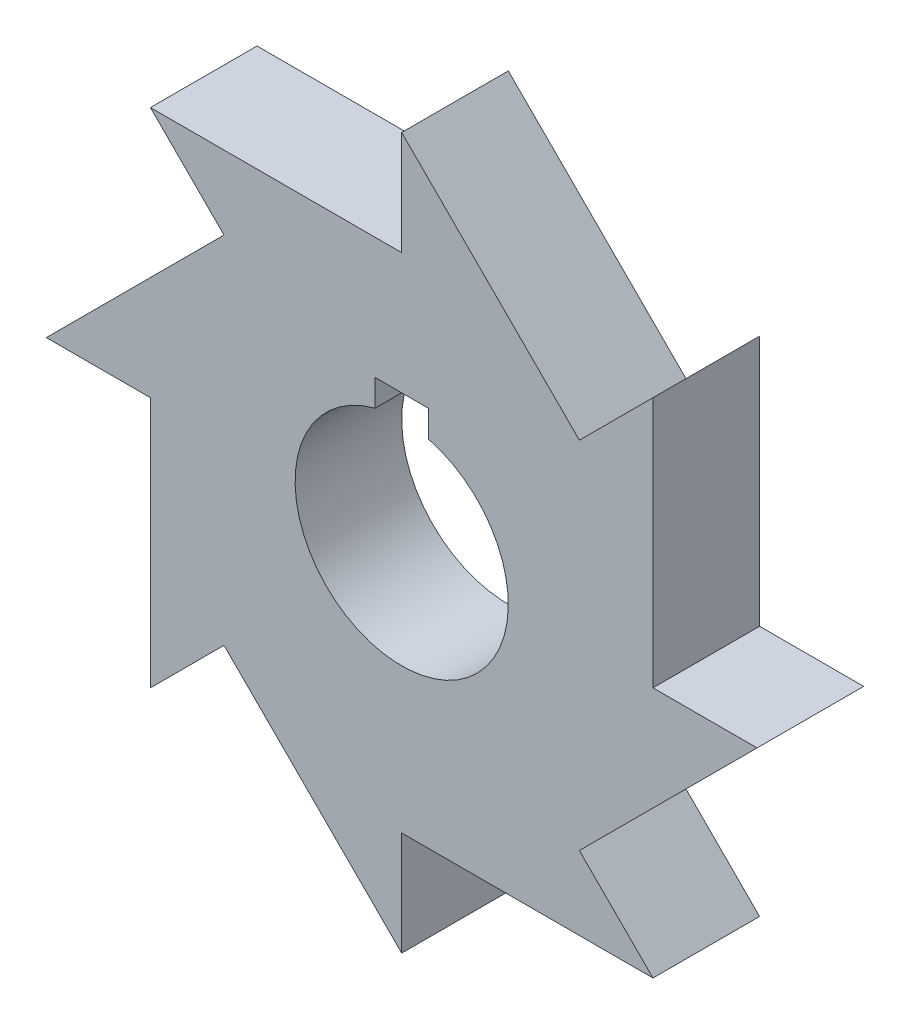
ISO-10303-21;
HEADER;
FILE_DESCRIPTION(('STEP AP214'),'2;1');
FILE_NAME('part.step','',(''),(''),'','','');
FILE_SCHEMA(('AUTOMOTIVE_DESIGN { 1 0 10303 214 1 1 1 1 }'));
ENDSEC;
DATA;
#1=APPLICATION_CONTEXT('core data for automotive mechanical design processes');
#2=APPLICATION_PROTOCOL_DEFINITION('international standard','automotive_design',2000,#1);
#3=PRODUCT_CONTEXT('',#1,'mechanical');
#4=PRODUCT('Part','Part','',(#3));
#5=PRODUCT_RELATED_PRODUCT_CATEGORY('part','',(#4));
#6=PRODUCT_DEFINITION_FORMATION('','',#4);
#7=PRODUCT_DEFINITION_CONTEXT('part definition',#1,'design');
#8=PRODUCT_DEFINITION('design','',#6,#7);
#9=PRODUCT_DEFINITION_SHAPE('','',#8);
#10=(LENGTH_UNIT() NAMED_UNIT(*) SI_UNIT(.MILLI.,.METRE.));
#11=(NAMED_UNIT(*) PLANE_ANGLE_UNIT() SI_UNIT($,.RADIAN.));
#12=(NAMED_UNIT(*) SI_UNIT($,.STERADIAN.) SOLID_ANGLE_UNIT());
#13=UNCERTAINTY_MEASURE_WITH_UNIT(LENGTH_MEASURE(1.E-05),#10,'distance_accuracy_value','');
#14=(GEOMETRIC_REPRESENTATION_CONTEXT(3) GLOBAL_UNCERTAINTY_ASSIGNED_CONTEXT((#13)) GLOBAL_UNIT_ASSIGNED_CONTEXT((#10,
#11,#12)) REPRESENTATION_CONTEXT('',''));
#15=CARTESIAN_POINT('',(0.,0.,0.));
#16=DIRECTION('',(0.,0.,1.));
#17=DIRECTION('',(1.,0.,0.));
#18=AXIS2_PLACEMENT_3D('',#15,#16,#17);
#19=CARTESIAN_POINT('',(0.,0.,9.525));
#20=DIRECTION('',(0.,0.,-1.));
#21=DIRECTION('',(-1.,0.,0.));
#22=AXIS2_PLACEMENT_3D('',#19,#20,#21);
#23=PLANE('',#22);
#24=DIRECTION('',(0.,-1.,0.));
#25=VECTOR('',#24,1.);
#26=CARTESIAN_POINT('',(0.,44.901280605346,9.525));
#27=LINE('',#26,#25);
#28=CARTESIAN_POINT('',(0.,63.4999999999997,9.525));
#29=VERTEX_POINT('',#28);
#30=CARTESIAN_POINT('',(0.,44.901280605346,9.525));
#31=VERTEX_POINT('',#30);
#32=EDGE_CURVE('E229',#29,#31,#27,.T.);
#33=ORIENTED_EDGE('',*,*,#32,.T.);
#34=DIRECTION('',(-1.,0.,0.));
#35=VECTOR('',#34,1.);
#36=CARTESIAN_POINT('',(-44.9012806053455,44.901280605346,9.525));
#37=LINE('',#36,#35);
#38=CARTESIAN_POINT('',(-44.9012806053455,44.901280605346,9.525));
#39=VERTEX_POINT('',#38);
#40=EDGE_CURVE('E233',#31,#39,#37,.T.);
#41=ORIENTED_EDGE('',*,*,#40,.T.);
#42=DIRECTION('',(0.707106781186544,-0.707106781186551,0.));
#43=VECTOR('',#42,1.);
#44=CARTESIAN_POINT('',(-31.7499999999997,31.75,9.525));
#45=LINE('',#44,#43);
#46=CARTESIAN_POINT('',(-31.7499999999997,31.75,9.525));
#47=VERTEX_POINT('',#46);
#48=EDGE_CURVE('E237',#39,#47,#45,.T.);
#49=ORIENTED_EDGE('',*,*,#48,.T.);
#50=DIRECTION('',(-0.707106781186551,-0.707106781186544,0.));
#51=VECTOR('',#50,1.);
#52=CARTESIAN_POINT('',(-63.5,0.,9.525));
#53=LINE('',#52,#51);
#54=CARTESIAN_POINT('',(-63.5,0.,9.525));
#55=VERTEX_POINT('',#54);
#56=EDGE_CURVE('E240',#47,#55,#53,.T.);
#57=ORIENTED_EDGE('',*,*,#56,.T.);
#58=DIRECTION('',(1.,0.,0.));
#59=VECTOR('',#58,1.);
#60=CARTESIAN_POINT('',(-44.9012806053455,0.,9.525));
#61=LINE('',#60,#59);
#62=CARTESIAN_POINT('',(-44.9012806053455,0.,9.525));
#63=VERTEX_POINT('',#62);
#64=EDGE_CURVE('E243',#55,#63,#61,.T.);
#65=ORIENTED_EDGE('',*,*,#64,.T.);
#66=DIRECTION('',(0.,-1.,0.));
#67=VECTOR('',#66,1.);
#68=CARTESIAN_POINT('',(-44.9012806053455,-44.9012806053461,9.525));
#69=LINE('',#68,#67);
#70=CARTESIAN_POINT('',(-44.9012806053455,-44.9012806053461,9.525));
#71=VERTEX_POINT('',#70);
#72=EDGE_CURVE('E246',#63,#71,#69,.T.);
#73=ORIENTED_EDGE('',*,*,#72,.T.);
#74=DIRECTION('',(0.707106781186543,0.707106781186552,0.));
#75=VECTOR('',#74,1.);
#76=CARTESIAN_POINT('',(-31.75,-31.7500000000004,9.525));
#77=LINE('',#76,#75);
#78=CARTESIAN_POINT('',(-31.75,-31.7500000000004,9.525));
#79=VERTEX_POINT('',#78);
#80=EDGE_CURVE('E249',#71,#79,#77,.T.);
#81=ORIENTED_EDGE('',*,*,#80,.T.);
#82=DIRECTION('',(0.707106781186552,-0.707106781186543,0.));
#83=VECTOR('',#82,1.);
#84=CARTESIAN_POINT('',(0.,-63.5,9.525));
#85=LINE('',#84,#83);
#86=CARTESIAN_POINT('',(0.,-63.5,9.525));
#87=VERTEX_POINT('',#86);
#88=EDGE_CURVE('E252',#79,#87,#85,.T.);
#89=ORIENTED_EDGE('',*,*,#88,.T.);
#90=DIRECTION('',(0.,1.,0.));
#91=VECTOR('',#90,1.);
#92=CARTESIAN_POINT('',(0.,-44.901280605346,9.525));
#93=LINE('',#92,#91);
#94=CARTESIAN_POINT('',(0.,-44.901280605346,9.525));
#95=VERTEX_POINT('',#94);
#96=EDGE_CURVE('E255',#87,#95,#93,.T.);
#97=ORIENTED_EDGE('',*,*,#96,.T.);
#98=DIRECTION('',(1.,0.,0.));
#99=VECTOR('',#98,1.);
#100=CARTESIAN_POINT('',(44.9012806053456,-44.901280605346,9.525));
#101=LINE('',#100,#99);
#102=CARTESIAN_POINT('',(44.9012806053456,-44.901280605346,9.525));
#103=VERTEX_POINT('',#102);
#104=EDGE_CURVE('E258',#95,#103,#101,.T.);
#105=ORIENTED_EDGE('',*,*,#104,.T.);
#106=DIRECTION('',(-0.707106781186545,0.70710678118655,0.));
#107=VECTOR('',#106,1.);
#108=CARTESIAN_POINT('',(31.7499999999997,-31.75,9.525));
#109=LINE('',#108,#107);
#110=CARTESIAN_POINT('',(31.7499999999997,-31.75,9.525));
#111=VERTEX_POINT('',#110);
#112=EDGE_CURVE('E261',#103,#111,#109,.T.);
#113=ORIENTED_EDGE('',*,*,#112,.T.);
#114=DIRECTION('',(0.707106781186551,0.707106781186544,0.));
#115=VECTOR('',#114,1.);
#116=CARTESIAN_POINT('',(63.5,0.,9.525));
#117=LINE('',#116,#115);
#118=CARTESIAN_POINT('',(63.5,0.,9.525));
#119=VERTEX_POINT('',#118);
#120=EDGE_CURVE('E264',#111,#119,#117,.T.);
#121=ORIENTED_EDGE('',*,*,#120,.T.);
#122=DIRECTION('',(-1.,0.,0.));
#123=VECTOR('',#122,1.);
#124=CARTESIAN_POINT('',(44.9012806053455,0.,9.525));
#125=LINE('',#124,#123);
#126=CARTESIAN_POINT('',(44.9012806053455,0.,9.525));
#127=VERTEX_POINT('',#126);
#128=EDGE_CURVE('E267',#119,#127,#125,.T.);
#129=ORIENTED_EDGE('',*,*,#128,.T.);
#130=DIRECTION('',(0.,1.,0.));
#131=VECTOR('',#130,1.);
#132=CARTESIAN_POINT('',(44.9012806053455,44.9012806053461,9.525));
#133=LINE('',#132,#131);
#134=CARTESIAN_POINT('',(44.9012806053455,44.9012806053461,9.525));
#135=VERTEX_POINT('',#134);
#136=EDGE_CURVE('E270',#127,#135,#133,.T.);
#137=ORIENTED_EDGE('',*,*,#136,.T.);
#138=DIRECTION('',(-0.707106781186543,-0.707106781186552,0.));
#139=VECTOR('',#138,1.);
#140=CARTESIAN_POINT('',(31.7499999999999,31.7500000000003,9.525));
#141=LINE('',#140,#139);
#142=CARTESIAN_POINT('',(31.7499999999999,31.7500000000003,9.525));
#143=VERTEX_POINT('',#142);
#144=EDGE_CURVE('E273',#135,#143,#141,.T.);
#145=ORIENTED_EDGE('',*,*,#144,.T.);
#146=DIRECTION('',(-0.707106781186553,0.707106781186543,0.));
#147=VECTOR('',#146,1.);
#148=CARTESIAN_POINT('',(0.,63.4999999999997,9.525));
#149=LINE('',#148,#147);
#150=EDGE_CURVE('E276',#143,#29,#149,.T.);
#151=ORIENTED_EDGE('',*,*,#150,.T.);
#152=EDGE_LOOP('',(#33,#41,#49,#57,#65,#73,#81,#89,#97,#105,#113,#121,#129,#137,#145,#151));
#153=FACE_BOUND('',#152,.T.);
#154=DIRECTION('',(0.,-1.,0.));
#155=VECTOR('',#154,1.);
#156=CARTESIAN_POINT('',(-4.7625,23.2075831863128,9.525));
#157=LINE('',#156,#155);
#158=CARTESIAN_POINT('',(-4.7625,23.2075831863128,9.525));
#159=VERTEX_POINT('',#158);
#160=CARTESIAN_POINT('',(-4.7625,18.4450831863128,9.525));
#161=VERTEX_POINT('',#160);
#162=EDGE_CURVE('E181',#159,#161,#157,.T.);
#163=ORIENTED_EDGE('',*,*,#162,.F.);
#164=DIRECTION('',(-1.,0.,0.));
#165=VECTOR('',#164,1.);
#166=CARTESIAN_POINT('',(-4.7625,23.2075831863128,9.525));
#167=LINE('',#166,#165);
#168=CARTESIAN_POINT('',(4.7625,23.2075831863128,9.525));
#169=VERTEX_POINT('',#168);
#170=EDGE_CURVE('E207',#169,#159,#167,.T.);
#171=ORIENTED_EDGE('',*,*,#170,.F.);
#172=DIRECTION('',(0.,1.,0.));
#173=VECTOR('',#172,1.);
#174=CARTESIAN_POINT('',(4.7625,23.2075831863128,9.525));
#175=LINE('',#174,#173);
#176=CARTESIAN_POINT('',(4.7625,18.4450831863128,9.525));
#177=VERTEX_POINT('',#176);
#178=EDGE_CURVE('E203',#177,#169,#175,.T.);
#179=ORIENTED_EDGE('',*,*,#178,.F.);
#180=CARTESIAN_POINT('',(0.,0.,9.525));
#181=DIRECTION('',(0.,0.,1.));
#182=DIRECTION('',(1.,0.,0.));
#183=AXIS2_PLACEMENT_3D('',#180,#181,#182);
#184=CIRCLE('',#183,19.05);
#185=EDGE_CURVE('E190',#161,#177,#184,.T.);
#186=ORIENTED_EDGE('',*,*,#185,.F.);
#187=EDGE_LOOP('',(#163,#171,#179,#186));
#188=FACE_BOUND('',#187,.T.);
#189=ADVANCED_FACE('F43',(#153,#188),#23,.F.);
#190=CARTESIAN_POINT('',(0.,0.,-9.525));
#191=DIRECTION('',(0.,0.,-1.));
#192=DIRECTION('',(-1.,0.,0.));
#193=AXIS2_PLACEMENT_3D('',#190,#191,#192);
#194=PLANE('',#193);
#195=DIRECTION('',(0.,-1.,0.));
#196=VECTOR('',#195,1.);
#197=CARTESIAN_POINT('',(0.,44.901280605346,-9.525));
#198=LINE('',#197,#196);
#199=CARTESIAN_POINT('',(0.,63.4999999999997,-9.525));
#200=VERTEX_POINT('',#199);
#201=CARTESIAN_POINT('',(0.,44.901280605346,-9.525));
#202=VERTEX_POINT('',#201);
#203=EDGE_CURVE('E199',#200,#202,#198,.T.);
#204=ORIENTED_EDGE('',*,*,#203,.F.);
#205=DIRECTION('',(-0.707106781186553,0.707106781186543,0.));
#206=VECTOR('',#205,1.);
#207=CARTESIAN_POINT('',(0.,63.4999999999997,-9.525));
#208=LINE('',#207,#206);
#209=CARTESIAN_POINT('',(31.7499999999999,31.7500000000003,-9.525));
#210=VERTEX_POINT('',#209);
#211=EDGE_CURVE('E234',#210,#200,#208,.T.);
#212=ORIENTED_EDGE('',*,*,#211,.F.);
#213=DIRECTION('',(-0.707106781186543,-0.707106781186552,0.));
#214=VECTOR('',#213,1.);
#215=CARTESIAN_POINT('',(31.7499999999999,31.7500000000003,-9.525));
#216=LINE('',#215,#214);
#217=CARTESIAN_POINT('',(44.9012806053455,44.9012806053461,-9.525));
#218=VERTEX_POINT('',#217);
#219=EDGE_CURVE('E322',#218,#210,#216,.T.);
#220=ORIENTED_EDGE('',*,*,#219,.F.);
#221=DIRECTION('',(0.,1.,0.));
#222=VECTOR('',#221,1.);
#223=CARTESIAN_POINT('',(44.9012806053455,44.9012806053461,-9.525));
#224=LINE('',#223,#222);
#225=CARTESIAN_POINT('',(44.9012806053455,0.,-9.525));
#226=VERTEX_POINT('',#225);
#227=EDGE_CURVE('E319',#226,#218,#224,.T.);
#228=ORIENTED_EDGE('',*,*,#227,.F.);
#229=DIRECTION('',(-1.,0.,0.));
#230=VECTOR('',#229,1.);
#231=CARTESIAN_POINT('',(44.9012806053455,0.,-9.525));
#232=LINE('',#231,#230);
#233=CARTESIAN_POINT('',(63.5,0.,-9.525));
#234=VERTEX_POINT('',#233);
#235=EDGE_CURVE('E316',#234,#226,#232,.T.);
#236=ORIENTED_EDGE('',*,*,#235,.F.);
#237=DIRECTION('',(0.707106781186551,0.707106781186544,0.));
#238=VECTOR('',#237,1.);
#239=CARTESIAN_POINT('',(63.5,0.,-9.525));
#240=LINE('',#239,#238);
#241=CARTESIAN_POINT('',(31.7499999999997,-31.75,-9.525));
#242=VERTEX_POINT('',#241);
#243=EDGE_CURVE('E313',#242,#234,#240,.T.);
#244=ORIENTED_EDGE('',*,*,#243,.F.);
#245=DIRECTION('',(-0.707106781186545,0.70710678118655,0.));
#246=VECTOR('',#245,1.);
#247=CARTESIAN_POINT('',(31.7499999999997,-31.75,-9.525));
#248=LINE('',#247,#246);
#249=CARTESIAN_POINT('',(44.9012806053456,-44.901280605346,-9.525));
#250=VERTEX_POINT('',#249);
#251=EDGE_CURVE('E310',#250,#242,#248,.T.);
#252=ORIENTED_EDGE('',*,*,#251,.F.);
#253=DIRECTION('',(1.,0.,0.));
#254=VECTOR('',#253,1.);
#255=CARTESIAN_POINT('',(44.9012806053456,-44.901280605346,-9.525));
#256=LINE('',#255,#254);
#257=CARTESIAN_POINT('',(0.,-44.901280605346,-9.525));
#258=VERTEX_POINT('',#257);
#259=EDGE_CURVE('E307',#258,#250,#256,.T.);
#260=ORIENTED_EDGE('',*,*,#259,.F.);
#261=DIRECTION('',(0.,1.,0.));
#262=VECTOR('',#261,1.);
#263=CARTESIAN_POINT('',(0.,-44.901280605346,-9.525));
#264=LINE('',#263,#262);
#265=CARTESIAN_POINT('',(0.,-63.5,-9.525));
#266=VERTEX_POINT('',#265);
#267=EDGE_CURVE('E304',#266,#258,#264,.T.);
#268=ORIENTED_EDGE('',*,*,#267,.F.);
#269=DIRECTION('',(0.707106781186552,-0.707106781186543,0.));
#270=VECTOR('',#269,1.);
#271=CARTESIAN_POINT('',(0.,-63.5,-9.525));
#272=LINE('',#271,#270);
#273=CARTESIAN_POINT('',(-31.75,-31.7500000000004,-9.525));
#274=VERTEX_POINT('',#273);
#275=EDGE_CURVE('E301',#274,#266,#272,.T.);
#276=ORIENTED_EDGE('',*,*,#275,.F.);
#277=DIRECTION('',(0.707106781186543,0.707106781186552,0.));
#278=VECTOR('',#277,1.);
#279=CARTESIAN_POINT('',(-31.75,-31.7500000000004,-9.525));
#280=LINE('',#279,#278);
#281=CARTESIAN_POINT('',(-44.9012806053455,-44.9012806053461,-9.525));
#282=VERTEX_POINT('',#281);
#283=EDGE_CURVE('E298',#282,#274,#280,.T.);
#284=ORIENTED_EDGE('',*,*,#283,.F.);
#285=DIRECTION('',(0.,-1.,0.));
#286=VECTOR('',#285,1.);
#287=CARTESIAN_POINT('',(-44.9012806053455,-44.9012806053461,-9.525));
#288=LINE('',#287,#286);
#289=CARTESIAN_POINT('',(-44.9012806053455,0.,-9.525));
#290=VERTEX_POINT('',#289);
#291=EDGE_CURVE('E295',#290,#282,#288,.T.);
#292=ORIENTED_EDGE('',*,*,#291,.F.);
#293=DIRECTION('',(1.,0.,0.));
#294=VECTOR('',#293,1.);
#295=CARTESIAN_POINT('',(-44.9012806053455,0.,-9.525));
#296=LINE('',#295,#294);
#297=CARTESIAN_POINT('',(-63.5,0.,-9.525));
#298=VERTEX_POINT('',#297);
#299=EDGE_CURVE('E292',#298,#290,#296,.T.);
#300=ORIENTED_EDGE('',*,*,#299,.F.);
#301=DIRECTION('',(-0.707106781186551,-0.707106781186544,0.));
#302=VECTOR('',#301,1.);
#303=CARTESIAN_POINT('',(-63.5,0.,-9.525));
#304=LINE('',#303,#302);
#305=CARTESIAN_POINT('',(-31.7499999999997,31.75,-9.525));
#306=VERTEX_POINT('',#305);
#307=EDGE_CURVE('E289',#306,#298,#304,.T.);
#308=ORIENTED_EDGE('',*,*,#307,.F.);
#309=DIRECTION('',(0.707106781186544,-0.707106781186551,0.));
#310=VECTOR('',#309,1.);
#311=CARTESIAN_POINT('',(-31.7499999999997,31.75,-9.525));
#312=LINE('',#311,#310);
#313=CARTESIAN_POINT('',(-44.9012806053455,44.901280605346,-9.525));
#314=VERTEX_POINT('',#313);
#315=EDGE_CURVE('E286',#314,#306,#312,.T.);
#316=ORIENTED_EDGE('',*,*,#315,.F.);
#317=DIRECTION('',(-1.,0.,0.));
#318=VECTOR('',#317,1.);
#319=CARTESIAN_POINT('',(-44.9012806053455,44.901280605346,-9.525));
#320=LINE('',#319,#318);
#321=EDGE_CURVE('E283',#202,#314,#320,.T.);
#322=ORIENTED_EDGE('',*,*,#321,.F.);
#323=EDGE_LOOP('',(#204,#212,#220,#228,#236,#244,#252,#260,#268,#276,#284,#292,#300,#308,#316,#322));
#324=FACE_BOUND('',#323,.T.);
#325=DIRECTION('',(-1.,0.,0.));
#326=VECTOR('',#325,1.);
#327=CARTESIAN_POINT('',(-4.7625,23.2075831863128,-9.525));
#328=LINE('',#327,#326);
#329=CARTESIAN_POINT('',(4.7625,23.2075831863128,-9.525));
#330=VERTEX_POINT('',#329);
#331=CARTESIAN_POINT('',(-4.7625,23.2075831863128,-9.525));
#332=VERTEX_POINT('',#331);
#333=EDGE_CURVE('E191',#330,#332,#328,.T.);
#334=ORIENTED_EDGE('',*,*,#333,.T.);
#335=DIRECTION('',(0.,-1.,0.));
#336=VECTOR('',#335,1.);
#337=CARTESIAN_POINT('',(-4.7625,23.2075831863128,-9.525));
#338=LINE('',#337,#336);
#339=CARTESIAN_POINT('',(-4.7625,18.4450831863128,-9.525));
#340=VERTEX_POINT('',#339);
#341=EDGE_CURVE('E67',#332,#340,#338,.T.);
#342=ORIENTED_EDGE('',*,*,#341,.T.);
#343=CARTESIAN_POINT('',(0.,0.,-9.525));
#344=DIRECTION('',(0.,0.,1.));
#345=DIRECTION('',(1.,0.,0.));
#346=AXIS2_PLACEMENT_3D('',#343,#344,#345);
#347=CIRCLE('',#346,19.05);
#348=CARTESIAN_POINT('',(4.7625,18.4450831863128,-9.525));
#349=VERTEX_POINT('',#348);
#350=EDGE_CURVE('E197',#340,#349,#347,.T.);
#351=ORIENTED_EDGE('',*,*,#350,.T.);
#352=DIRECTION('',(0.,1.,0.));
#353=VECTOR('',#352,1.);
#354=CARTESIAN_POINT('',(4.7625,23.2075831863128,-9.525));
#355=LINE('',#354,#353);
#356=EDGE_CURVE('E216',#349,#330,#355,.T.);
#357=ORIENTED_EDGE('',*,*,#356,.T.);
#358=EDGE_LOOP('',(#334,#342,#351,#357));
#359=FACE_BOUND('',#358,.T.);
#360=ADVANCED_FACE('F393',(#324,#359),#194,.T.);
#361=CARTESIAN_POINT('',(0.,44.901280605346,9.525));
#362=DIRECTION('',(1.,0.,0.));
#363=DIRECTION('',(0.,0.,-1.));
#364=AXIS2_PLACEMENT_3D('',#361,#362,#363);
#365=PLANE('',#364);
#366=ORIENTED_EDGE('',*,*,#203,.T.);
#367=DIRECTION('',(0.,0.,-1.));
#368=VECTOR('',#367,1.);
#369=CARTESIAN_POINT('',(0.,44.901280605346,9.525));
#370=LINE('',#369,#368);
#371=EDGE_CURVE('E11',#31,#202,#370,.T.);
#372=ORIENTED_EDGE('',*,*,#371,.F.);
#373=ORIENTED_EDGE('',*,*,#32,.F.);
#374=DIRECTION('',(0.,0.,-1.));
#375=VECTOR('',#374,1.);
#376=CARTESIAN_POINT('',(0.,63.4999999999997,9.525));
#377=LINE('',#376,#375);
#378=EDGE_CURVE('E279',#29,#200,#377,.T.);
#379=ORIENTED_EDGE('',*,*,#378,.T.);
#380=EDGE_LOOP('',(#366,#372,#373,#379));
#381=FACE_BOUND('',#380,.T.);
#382=ADVANCED_FACE('F45',(#381),#365,.F.);
#383=CARTESIAN_POINT('',(-44.9012806053455,44.901280605346,9.525));
#384=DIRECTION('',(0.,-1.,0.));
#385=DIRECTION('',(0.,0.,-1.));
#386=AXIS2_PLACEMENT_3D('',#383,#384,#385);
#387=PLANE('',#386);
#388=ORIENTED_EDGE('',*,*,#321,.T.);
#389=DIRECTION('',(0.,0.,-1.));
#390=VECTOR('',#389,1.);
#391=CARTESIAN_POINT('',(-44.9012806053455,44.901280605346,9.525));
#392=LINE('',#391,#390);
#393=EDGE_CURVE('E52',#39,#314,#392,.T.);
#394=ORIENTED_EDGE('',*,*,#393,.F.);
#395=ORIENTED_EDGE('',*,*,#40,.F.);
#396=ORIENTED_EDGE('',*,*,#371,.T.);
#397=EDGE_LOOP('',(#388,#394,#395,#396));
#398=FACE_BOUND('',#397,.T.);
#399=ADVANCED_FACE('F410',(#398),#387,.F.);
#400=CARTESIAN_POINT('',(-31.7499999999997,31.75,9.525));
#401=DIRECTION('',(0.707106781186551,0.707106781186544,0.));
#402=DIRECTION('',(-0.707106781186544,0.707106781186551,0.));
#403=AXIS2_PLACEMENT_3D('',#400,#401,#402);
#404=PLANE('',#403);
#405=ORIENTED_EDGE('',*,*,#315,.T.);
#406=DIRECTION('',(0.,0.,-1.));
#407=VECTOR('',#406,1.);
#408=CARTESIAN_POINT('',(-31.7499999999997,31.75,9.525));
#409=LINE('',#408,#407);
#410=EDGE_CURVE('E378',#47,#306,#409,.T.);
#411=ORIENTED_EDGE('',*,*,#410,.F.);
#412=ORIENTED_EDGE('',*,*,#48,.F.);
#413=ORIENTED_EDGE('',*,*,#393,.T.);
#414=EDGE_LOOP('',(#405,#411,#412,#413));
#415=FACE_BOUND('',#414,.T.);
#416=ADVANCED_FACE('F387',(#415),#404,.F.);
#417=CARTESIAN_POINT('',(-63.5,0.,9.525));
#418=DIRECTION('',(0.707106781186544,-0.707106781186551,0.));
#419=DIRECTION('',(0.707106781186551,0.707106781186544,0.));
#420=AXIS2_PLACEMENT_3D('',#417,#418,#419);
#421=PLANE('',#420);
#422=ORIENTED_EDGE('',*,*,#307,.T.);
#423=DIRECTION('',(0.,0.,-1.));
#424=VECTOR('',#423,1.);
#425=CARTESIAN_POINT('',(-63.5,0.,9.525));
#426=LINE('',#425,#424);
#427=EDGE_CURVE('E374',#55,#298,#426,.T.);
#428=ORIENTED_EDGE('',*,*,#427,.F.);
#429=ORIENTED_EDGE('',*,*,#56,.F.);
#430=ORIENTED_EDGE('',*,*,#410,.T.);
#431=EDGE_LOOP('',(#422,#428,#429,#430));
#432=FACE_BOUND('',#431,.T.);
#433=ADVANCED_FACE('F399',(#432),#421,.F.);
#434=CARTESIAN_POINT('',(-44.9012806053455,0.,9.525));
#435=DIRECTION('',(0.,1.,0.));
#436=DIRECTION('',(-1.,0.,0.));
#437=AXIS2_PLACEMENT_3D('',#434,#435,#436);
#438=PLANE('',#437);
#439=ORIENTED_EDGE('',*,*,#299,.T.);
#440=DIRECTION('',(0.,0.,-1.));
#441=VECTOR('',#440,1.);
#442=CARTESIAN_POINT('',(-44.9012806053455,0.,9.525));
#443=LINE('',#442,#441);
#444=EDGE_CURVE('E370',#63,#290,#443,.T.);
#445=ORIENTED_EDGE('',*,*,#444,.F.);
#446=ORIENTED_EDGE('',*,*,#64,.F.);
#447=ORIENTED_EDGE('',*,*,#427,.T.);
#448=EDGE_LOOP('',(#439,#445,#446,#447));
#449=FACE_BOUND('',#448,.T.);
#450=ADVANCED_FACE('F403',(#449),#438,.F.);
#451=CARTESIAN_POINT('',(-44.9012806053455,-44.9012806053461,9.525));
#452=DIRECTION('',(1.,0.,0.));
#453=DIRECTION('',(0.,1.,0.));
#454=AXIS2_PLACEMENT_3D('',#451,#452,#453);
#455=PLANE('',#454);
#456=ORIENTED_EDGE('',*,*,#291,.T.);
#457=DIRECTION('',(0.,0.,-1.));
#458=VECTOR('',#457,1.);
#459=CARTESIAN_POINT('',(-44.9012806053455,-44.9012806053461,9.525));
#460=LINE('',#459,#458);
#461=EDGE_CURVE('E366',#71,#282,#460,.T.);
#462=ORIENTED_EDGE('',*,*,#461,.F.);
#463=ORIENTED_EDGE('',*,*,#72,.F.);
#464=ORIENTED_EDGE('',*,*,#444,.T.);
#465=EDGE_LOOP('',(#456,#462,#463,#464));
#466=FACE_BOUND('',#465,.T.);
#467=ADVANCED_FACE('F463',(#466),#455,.F.);
#468=CARTESIAN_POINT('',(-31.75,-31.7500000000004,9.525));
#469=DIRECTION('',(-0.707106781186552,0.707106781186543,0.));
#470=DIRECTION('',(-0.707106781186543,-0.707106781186552,0.));
#471=AXIS2_PLACEMENT_3D('',#468,#469,#470);
#472=PLANE('',#471);
#473=ORIENTED_EDGE('',*,*,#283,.T.);
#474=DIRECTION('',(0.,0.,-1.));
#475=VECTOR('',#474,1.);
#476=CARTESIAN_POINT('',(-31.75,-31.7500000000004,9.525));
#477=LINE('',#476,#475);
#478=EDGE_CURVE('E362',#79,#274,#477,.T.);
#479=ORIENTED_EDGE('',*,*,#478,.F.);
#480=ORIENTED_EDGE('',*,*,#80,.F.);
#481=ORIENTED_EDGE('',*,*,#461,.T.);
#482=EDGE_LOOP('',(#473,#479,#480,#481));
#483=FACE_BOUND('',#482,.T.);
#484=ADVANCED_FACE('F460',(#483),#472,.F.);
#485=CARTESIAN_POINT('',(0.,-63.5,9.525));
#486=DIRECTION('',(0.707106781186543,0.707106781186552,0.));
#487=DIRECTION('',(-0.707106781186552,0.707106781186543,0.));
#488=AXIS2_PLACEMENT_3D('',#485,#486,#487);
#489=PLANE('',#488);
#490=ORIENTED_EDGE('',*,*,#275,.T.);
#491=DIRECTION('',(0.,0.,-1.));
#492=VECTOR('',#491,1.);
#493=CARTESIAN_POINT('',(0.,-63.5,9.525));
#494=LINE('',#493,#492);
#495=EDGE_CURVE('E358',#87,#266,#494,.T.);
#496=ORIENTED_EDGE('',*,*,#495,.F.);
#497=ORIENTED_EDGE('',*,*,#88,.F.);
#498=ORIENTED_EDGE('',*,*,#478,.T.);
#499=EDGE_LOOP('',(#490,#496,#497,#498));
#500=FACE_BOUND('',#499,.T.);
#501=ADVANCED_FACE('F456',(#500),#489,.F.);
#502=CARTESIAN_POINT('',(0.,-44.901280605346,9.525));
#503=DIRECTION('',(-1.,0.,0.));
#504=DIRECTION('',(0.,-1.,0.));
#505=AXIS2_PLACEMENT_3D('',#502,#503,#504);
#506=PLANE('',#505);
#507=ORIENTED_EDGE('',*,*,#267,.T.);
#508=DIRECTION('',(0.,0.,-1.));
#509=VECTOR('',#508,1.);
#510=CARTESIAN_POINT('',(0.,-44.901280605346,9.525));
#511=LINE('',#510,#509);
#512=EDGE_CURVE('E354',#95,#258,#511,.T.);
#513=ORIENTED_EDGE('',*,*,#512,.F.);
#514=ORIENTED_EDGE('',*,*,#96,.F.);
#515=ORIENTED_EDGE('',*,*,#495,.T.);
#516=EDGE_LOOP('',(#507,#513,#514,#515));
#517=FACE_BOUND('',#516,.T.);
#518=ADVANCED_FACE('F452',(#517),#506,.F.);
#519=CARTESIAN_POINT('',(44.9012806053456,-44.901280605346,9.525));
#520=DIRECTION('',(0.,1.,0.));
#521=DIRECTION('',(-1.,0.,0.));
#522=AXIS2_PLACEMENT_3D('',#519,#520,#521);
#523=PLANE('',#522);
#524=ORIENTED_EDGE('',*,*,#259,.T.);
#525=DIRECTION('',(0.,0.,-1.));
#526=VECTOR('',#525,1.);
#527=CARTESIAN_POINT('',(44.9012806053456,-44.901280605346,9.525));
#528=LINE('',#527,#526);
#529=EDGE_CURVE('E350',#103,#250,#528,.T.);
#530=ORIENTED_EDGE('',*,*,#529,.F.);
#531=ORIENTED_EDGE('',*,*,#104,.F.);
#532=ORIENTED_EDGE('',*,*,#512,.T.);
#533=EDGE_LOOP('',(#524,#530,#531,#532));
#534=FACE_BOUND('',#533,.T.);
#535=ADVANCED_FACE('F447',(#534),#523,.F.);
#536=CARTESIAN_POINT('',(31.7499999999997,-31.75,9.525));
#537=DIRECTION('',(-0.70710678118655,-0.707106781186545,0.));
#538=DIRECTION('',(0.707106781186545,-0.70710678118655,0.));
#539=AXIS2_PLACEMENT_3D('',#536,#537,#538);
#540=PLANE('',#539);
#541=ORIENTED_EDGE('',*,*,#251,.T.);
#542=DIRECTION('',(0.,0.,-1.));
#543=VECTOR('',#542,1.);
#544=CARTESIAN_POINT('',(31.7499999999997,-31.75,9.525));
#545=LINE('',#544,#543);
#546=EDGE_CURVE('E346',#111,#242,#545,.T.);
#547=ORIENTED_EDGE('',*,*,#546,.F.);
#548=ORIENTED_EDGE('',*,*,#112,.F.);
#549=ORIENTED_EDGE('',*,*,#529,.T.);
#550=EDGE_LOOP('',(#541,#547,#548,#549));
#551=FACE_BOUND('',#550,.T.);
#552=ADVANCED_FACE('F441',(#551),#540,.F.);
#553=CARTESIAN_POINT('',(63.5,0.,9.525));
#554=DIRECTION('',(-0.707106781186544,0.707106781186551,0.));
#555=DIRECTION('',(-0.707106781186551,-0.707106781186544,0.));
#556=AXIS2_PLACEMENT_3D('',#553,#554,#555);
#557=PLANE('',#556);
#558=ORIENTED_EDGE('',*,*,#243,.T.);
#559=DIRECTION('',(0.,0.,-1.));
#560=VECTOR('',#559,1.);
#561=CARTESIAN_POINT('',(63.5,0.,9.525));
#562=LINE('',#561,#560);
#563=EDGE_CURVE('E342',#119,#234,#562,.T.);
#564=ORIENTED_EDGE('',*,*,#563,.F.);
#565=ORIENTED_EDGE('',*,*,#120,.F.);
#566=ORIENTED_EDGE('',*,*,#546,.T.);
#567=EDGE_LOOP('',(#558,#564,#565,#566));
#568=FACE_BOUND('',#567,.T.);
#569=ADVANCED_FACE('F437',(#568),#557,.F.);
#570=CARTESIAN_POINT('',(44.9012806053455,0.,9.525));
#571=DIRECTION('',(0.,-1.,0.));
#572=DIRECTION('',(0.,0.,-1.));
#573=AXIS2_PLACEMENT_3D('',#570,#571,#572);
#574=PLANE('',#573);
#575=ORIENTED_EDGE('',*,*,#235,.T.);
#576=DIRECTION('',(0.,0.,-1.));
#577=VECTOR('',#576,1.);
#578=CARTESIAN_POINT('',(44.9012806053455,0.,9.525));
#579=LINE('',#578,#577);
#580=EDGE_CURVE('E338',#127,#226,#579,.T.);
#581=ORIENTED_EDGE('',*,*,#580,.F.);
#582=ORIENTED_EDGE('',*,*,#128,.F.);
#583=ORIENTED_EDGE('',*,*,#563,.T.);
#584=EDGE_LOOP('',(#575,#581,#582,#583));
#585=FACE_BOUND('',#584,.T.);
#586=ADVANCED_FACE('F432',(#585),#574,.F.);
#587=CARTESIAN_POINT('',(44.9012806053455,44.9012806053461,9.525));
#588=DIRECTION('',(-1.,0.,0.));
#589=DIRECTION('',(0.,-1.,0.));
#590=AXIS2_PLACEMENT_3D('',#587,#588,#589);
#591=PLANE('',#590);
#592=ORIENTED_EDGE('',*,*,#227,.T.);
#593=DIRECTION('',(0.,0.,-1.));
#594=VECTOR('',#593,1.);
#595=CARTESIAN_POINT('',(44.9012806053455,44.9012806053461,9.525));
#596=LINE('',#595,#594);
#597=EDGE_CURVE('E334',#135,#218,#596,.T.);
#598=ORIENTED_EDGE('',*,*,#597,.F.);
#599=ORIENTED_EDGE('',*,*,#136,.F.);
#600=ORIENTED_EDGE('',*,*,#580,.T.);
#601=EDGE_LOOP('',(#592,#598,#599,#600));
#602=FACE_BOUND('',#601,.T.);
#603=ADVANCED_FACE('F426',(#602),#591,.F.);
#604=CARTESIAN_POINT('',(31.7499999999999,31.7500000000003,9.525));
#605=DIRECTION('',(0.707106781186552,-0.707106781186543,0.));
#606=DIRECTION('',(0.707106781186543,0.707106781186552,0.));
#607=AXIS2_PLACEMENT_3D('',#604,#605,#606);
#608=PLANE('',#607);
#609=ORIENTED_EDGE('',*,*,#219,.T.);
#610=DIRECTION('',(0.,0.,-1.));
#611=VECTOR('',#610,1.);
#612=CARTESIAN_POINT('',(31.7499999999999,31.7500000000003,9.525));
#613=LINE('',#612,#611);
#614=EDGE_CURVE('E330',#143,#210,#613,.T.);
#615=ORIENTED_EDGE('',*,*,#614,.F.);
#616=ORIENTED_EDGE('',*,*,#144,.F.);
#617=ORIENTED_EDGE('',*,*,#597,.T.);
#618=EDGE_LOOP('',(#609,#615,#616,#617));
#619=FACE_BOUND('',#618,.T.);
#620=ADVANCED_FACE('F422',(#619),#608,.F.);
#621=CARTESIAN_POINT('',(0.,63.4999999999997,9.525));
#622=DIRECTION('',(-0.707106781186542,-0.707106781186553,0.));
#623=DIRECTION('',(0.707106781186553,-0.707106781186542,0.));
#624=AXIS2_PLACEMENT_3D('',#621,#622,#623);
#625=PLANE('',#624);
#626=ORIENTED_EDGE('',*,*,#211,.T.);
#627=ORIENTED_EDGE('',*,*,#378,.F.);
#628=ORIENTED_EDGE('',*,*,#150,.F.);
#629=ORIENTED_EDGE('',*,*,#614,.T.);
#630=EDGE_LOOP('',(#626,#627,#628,#629));
#631=FACE_BOUND('',#630,.T.);
#632=ADVANCED_FACE('F417',(#631),#625,.F.);
#633=CARTESIAN_POINT('',(-4.7625,23.2075831863128,9.525));
#634=DIRECTION('',(1.,0.,0.));
#635=DIRECTION('',(0.,1.,0.));
#636=AXIS2_PLACEMENT_3D('',#633,#634,#635);
#637=PLANE('',#636);
#638=ORIENTED_EDGE('',*,*,#341,.F.);
#639=DIRECTION('',(0.,0.,-1.));
#640=VECTOR('',#639,1.);
#641=CARTESIAN_POINT('',(-4.7625,23.2075831863128,9.525));
#642=LINE('',#641,#640);
#643=EDGE_CURVE('E185',#159,#332,#642,.T.);
#644=ORIENTED_EDGE('',*,*,#643,.F.);
#645=ORIENTED_EDGE('',*,*,#162,.T.);
#646=DIRECTION('',(0.,0.,-1.));
#647=VECTOR('',#646,1.);
#648=CARTESIAN_POINT('',(-4.7625,18.4450831863128,9.525));
#649=LINE('',#648,#647);
#650=EDGE_CURVE('E184',#161,#340,#649,.T.);
#651=ORIENTED_EDGE('',*,*,#650,.T.);
#652=EDGE_LOOP('',(#638,#644,#645,#651));
#653=FACE_BOUND('',#652,.T.);
#654=ADVANCED_FACE('F183',(#653),#637,.T.);
#655=CARTESIAN_POINT('',(0.,0.,9.525));
#656=DIRECTION('',(0.,0.,-1.));
#657=DIRECTION('',(-1.,0.,0.));
#658=AXIS2_PLACEMENT_3D('',#655,#656,#657);
#659=CYLINDRICAL_SURFACE('',#658,19.05);
#660=ORIENTED_EDGE('',*,*,#350,.F.);
#661=ORIENTED_EDGE('',*,*,#650,.F.);
#662=ORIENTED_EDGE('',*,*,#185,.T.);
#663=DIRECTION('',(0.,0.,-1.));
#664=VECTOR('',#663,1.);
#665=CARTESIAN_POINT('',(4.7625,18.4450831863128,9.525));
#666=LINE('',#665,#664);
#667=EDGE_CURVE('E200',#177,#349,#666,.T.);
#668=ORIENTED_EDGE('',*,*,#667,.T.);
#669=EDGE_LOOP('',(#660,#661,#662,#668));
#670=FACE_BOUND('',#669,.T.);
#671=ADVANCED_FACE('F194',(#670),#659,.F.);
#672=CARTESIAN_POINT('',(4.7625,23.2075831863128,9.525));
#673=DIRECTION('',(-1.,0.,0.));
#674=DIRECTION('',(0.,0.,1.));
#675=AXIS2_PLACEMENT_3D('',#672,#673,#674);
#676=PLANE('',#675);
#677=ORIENTED_EDGE('',*,*,#356,.F.);
#678=ORIENTED_EDGE('',*,*,#667,.F.);
#679=ORIENTED_EDGE('',*,*,#178,.T.);
#680=DIRECTION('',(0.,0.,-1.));
#681=VECTOR('',#680,1.);
#682=CARTESIAN_POINT('',(4.7625,23.2075831863128,9.525));
#683=LINE('',#682,#681);
#684=EDGE_CURVE('E59',#169,#330,#683,.T.);
#685=ORIENTED_EDGE('',*,*,#684,.T.);
#686=EDGE_LOOP('',(#677,#678,#679,#685));
#687=FACE_BOUND('',#686,.T.);
#688=ADVANCED_FACE('F545',(#687),#676,.T.);
#689=CARTESIAN_POINT('',(-4.7625,23.2075831863128,9.525));
#690=DIRECTION('',(0.,-1.,0.));
#691=DIRECTION('',(1.,0.,0.));
#692=AXIS2_PLACEMENT_3D('',#689,#690,#691);
#693=PLANE('',#692);
#694=ORIENTED_EDGE('',*,*,#333,.F.);
#695=ORIENTED_EDGE('',*,*,#684,.F.);
#696=ORIENTED_EDGE('',*,*,#170,.T.);
#697=ORIENTED_EDGE('',*,*,#643,.T.);
#698=EDGE_LOOP('',(#694,#695,#696,#697));
#699=FACE_BOUND('',#698,.T.);
#700=ADVANCED_FACE('F551',(#699),#693,.T.);
#701=CLOSED_SHELL('',(#189,#360,#382,#399,#416,#433,#450,#467,#484,#501,#518,#535,#552,#569,
#586,#603,#620,#632,#654,#671,#688,#700));
#702=MANIFOLD_SOLID_BREP('B2',#701);
#703=ADVANCED_BREP_SHAPE_REPRESENTATION('',(#18,#702),#14);
#704=SHAPE_DEFINITION_REPRESENTATION(#9,#703);
ENDSEC;
END-ISO-10303-21;
